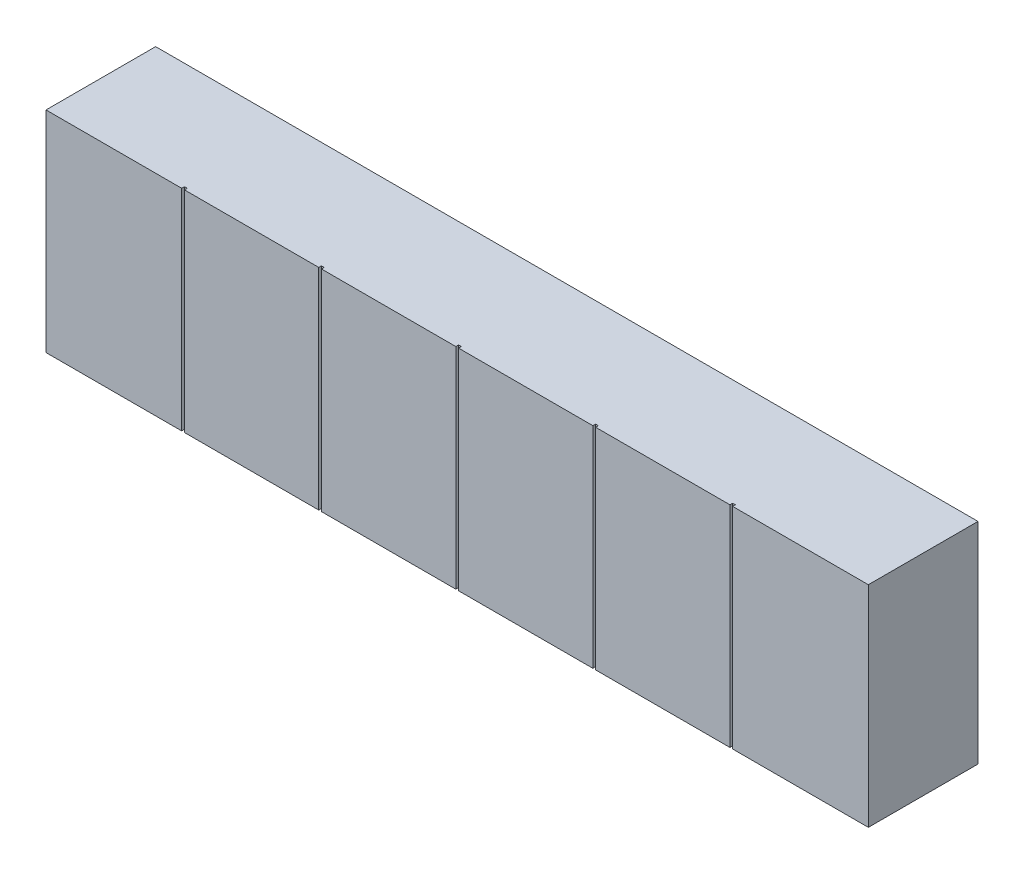
ISO-10303-21;
HEADER;
FILE_DESCRIPTION(('STEP AP214'),'2;1');
FILE_NAME('part.step','',(''),(''),'','','');
FILE_SCHEMA(('AUTOMOTIVE_DESIGN { 1 0 10303 214 1 1 1 1 }'));
ENDSEC;
DATA;
#1=APPLICATION_CONTEXT('core data for automotive mechanical design processes');
#2=APPLICATION_PROTOCOL_DEFINITION('international standard','automotive_design',2000,#1);
#3=PRODUCT_CONTEXT('',#1,'mechanical');
#4=PRODUCT('Part','Part','',(#3));
#5=PRODUCT_RELATED_PRODUCT_CATEGORY('part','',(#4));
#6=PRODUCT_DEFINITION_FORMATION('','',#4);
#7=PRODUCT_DEFINITION_CONTEXT('part definition',#1,'design');
#8=PRODUCT_DEFINITION('design','',#6,#7);
#9=PRODUCT_DEFINITION_SHAPE('','',#8);
#10=(LENGTH_UNIT() NAMED_UNIT(*) SI_UNIT(.MILLI.,.METRE.));
#11=(NAMED_UNIT(*) PLANE_ANGLE_UNIT() SI_UNIT($,.RADIAN.));
#12=(NAMED_UNIT(*) SI_UNIT($,.STERADIAN.) SOLID_ANGLE_UNIT());
#13=UNCERTAINTY_MEASURE_WITH_UNIT(LENGTH_MEASURE(1.E-05),#10,'distance_accuracy_value','');
#14=(GEOMETRIC_REPRESENTATION_CONTEXT(3) GLOBAL_UNCERTAINTY_ASSIGNED_CONTEXT((#13)) GLOBAL_UNIT_ASSIGNED_CONTEXT((#10,
#11,#12)) REPRESENTATION_CONTEXT('',''));
#15=CARTESIAN_POINT('',(0.,0.,0.));
#16=DIRECTION('',(0.,0.,1.));
#17=DIRECTION('',(1.,0.,0.));
#18=AXIS2_PLACEMENT_3D('',#15,#16,#17);
#19=CARTESIAN_POINT('',(0.,0.,120.));
#20=DIRECTION('',(0.,0.,-1.));
#21=DIRECTION('',(-1.,0.,0.));
#22=AXIS2_PLACEMENT_3D('',#19,#20,#21);
#23=PLANE('',#22);
#24=DIRECTION('',(1.,0.,0.));
#25=VECTOR('',#24,1.);
#26=CARTESIAN_POINT('',(-450.,-115.,120.));
#27=LINE('',#26,#25);
#28=CARTESIAN_POINT('',(-298.5,-115.,120.));
#29=VERTEX_POINT('',#28);
#30=CARTESIAN_POINT('',(-151.5,-115.,120.));
#31=VERTEX_POINT('',#30);
#32=EDGE_CURVE('E353',#29,#31,#27,.T.);
#33=ORIENTED_EDGE('',*,*,#32,.T.);
#34=DIRECTION('',(0.,-1.,0.));
#35=VECTOR('',#34,1.);
#36=CARTESIAN_POINT('',(-151.5,115.,120.));
#37=LINE('',#36,#35);
#38=CARTESIAN_POINT('',(-151.5,115.,120.));
#39=VERTEX_POINT('',#38);
#40=EDGE_CURVE('E199',#39,#31,#37,.T.);
#41=ORIENTED_EDGE('',*,*,#40,.F.);
#42=DIRECTION('',(-1.,0.,0.));
#43=VECTOR('',#42,1.);
#44=CARTESIAN_POINT('',(-450.,115.,120.));
#45=LINE('',#44,#43);
#46=CARTESIAN_POINT('',(-298.5,115.,120.));
#47=VERTEX_POINT('',#46);
#48=EDGE_CURVE('E346',#39,#47,#45,.T.);
#49=ORIENTED_EDGE('',*,*,#48,.T.);
#50=DIRECTION('',(0.,1.,0.));
#51=VECTOR('',#50,1.);
#52=CARTESIAN_POINT('',(-298.5,115.,120.));
#53=LINE('',#52,#51);
#54=EDGE_CURVE('E313',#29,#47,#53,.T.);
#55=ORIENTED_EDGE('',*,*,#54,.F.);
#56=EDGE_LOOP('',(#33,#41,#49,#55));
#57=FACE_BOUND('',#56,.T.);
#58=ADVANCED_FACE('F33',(#57),#23,.F.);
#59=CARTESIAN_POINT('',(-1.50000000000011,115.,120.));
#60=VERTEX_POINT('',#59);
#61=CARTESIAN_POINT('',(-148.5,115.,120.));
#62=VERTEX_POINT('',#61);
#63=EDGE_CURVE('E418',#60,#62,#45,.T.);
#64=ORIENTED_EDGE('',*,*,#63,.T.);
#65=DIRECTION('',(0.,1.,0.));
#66=VECTOR('',#65,1.);
#67=CARTESIAN_POINT('',(-148.5,115.,120.));
#68=LINE('',#67,#66);
#69=CARTESIAN_POINT('',(-148.5,-115.,120.));
#70=VERTEX_POINT('',#69);
#71=EDGE_CURVE('E215',#70,#62,#68,.T.);
#72=ORIENTED_EDGE('',*,*,#71,.F.);
#73=CARTESIAN_POINT('',(-1.5,-115.,120.));
#74=VERTEX_POINT('',#73);
#75=EDGE_CURVE('E393',#70,#74,#27,.T.);
#76=ORIENTED_EDGE('',*,*,#75,.T.);
#77=DIRECTION('',(0.,-1.,0.));
#78=VECTOR('',#77,1.);
#79=CARTESIAN_POINT('',(-1.50000000000011,115.,120.));
#80=LINE('',#79,#78);
#81=EDGE_CURVE('E248',#60,#74,#80,.T.);
#82=ORIENTED_EDGE('',*,*,#81,.F.);
#83=EDGE_LOOP('',(#64,#72,#76,#82));
#84=FACE_BOUND('',#83,.T.);
#85=ADVANCED_FACE('F426',(#84),#23,.F.);
#86=CARTESIAN_POINT('',(148.5,115.,120.));
#87=VERTEX_POINT('',#86);
#88=CARTESIAN_POINT('',(1.5,115.,120.));
#89=VERTEX_POINT('',#88);
#90=EDGE_CURVE('E420',#87,#89,#45,.T.);
#91=ORIENTED_EDGE('',*,*,#90,.T.);
#92=DIRECTION('',(0.,1.,0.));
#93=VECTOR('',#92,1.);
#94=CARTESIAN_POINT('',(1.5,115.,120.));
#95=LINE('',#94,#93);
#96=CARTESIAN_POINT('',(1.49999999999995,-115.,120.));
#97=VERTEX_POINT('',#96);
#98=EDGE_CURVE('E238',#97,#89,#95,.T.);
#99=ORIENTED_EDGE('',*,*,#98,.F.);
#100=CARTESIAN_POINT('',(148.5,-115.,120.));
#101=VERTEX_POINT('',#100);
#102=EDGE_CURVE('E388',#97,#101,#27,.T.);
#103=ORIENTED_EDGE('',*,*,#102,.T.);
#104=DIRECTION('',(0.,-1.,0.));
#105=VECTOR('',#104,1.);
#106=CARTESIAN_POINT('',(148.5,115.,120.));
#107=LINE('',#106,#105);
#108=EDGE_CURVE('E274',#87,#101,#107,.T.);
#109=ORIENTED_EDGE('',*,*,#108,.F.);
#110=EDGE_LOOP('',(#91,#99,#103,#109));
#111=FACE_BOUND('',#110,.T.);
#112=ADVANCED_FACE('F446',(#111),#23,.F.);
#113=CARTESIAN_POINT('',(298.5,115.,120.));
#114=VERTEX_POINT('',#113);
#115=CARTESIAN_POINT('',(151.5,115.,120.));
#116=VERTEX_POINT('',#115);
#117=EDGE_CURVE('E345',#114,#116,#45,.T.);
#118=ORIENTED_EDGE('',*,*,#117,.T.);
#119=DIRECTION('',(0.,1.,0.));
#120=VECTOR('',#119,1.);
#121=CARTESIAN_POINT('',(151.5,115.,120.));
#122=LINE('',#121,#120);
#123=CARTESIAN_POINT('',(151.5,-115.,120.));
#124=VERTEX_POINT('',#123);
#125=EDGE_CURVE('E264',#124,#116,#122,.T.);
#126=ORIENTED_EDGE('',*,*,#125,.F.);
#127=CARTESIAN_POINT('',(298.5,-115.,120.));
#128=VERTEX_POINT('',#127);
#129=EDGE_CURVE('E386',#124,#128,#27,.T.);
#130=ORIENTED_EDGE('',*,*,#129,.T.);
#131=DIRECTION('',(0.,-1.,0.));
#132=VECTOR('',#131,1.);
#133=CARTESIAN_POINT('',(298.5,115.,120.));
#134=LINE('',#133,#132);
#135=EDGE_CURVE('E299',#114,#128,#134,.T.);
#136=ORIENTED_EDGE('',*,*,#135,.F.);
#137=EDGE_LOOP('',(#118,#126,#130,#136));
#138=FACE_BOUND('',#137,.T.);
#139=ADVANCED_FACE('F456',(#138),#23,.F.);
#140=CARTESIAN_POINT('',(-450.,-115.,120.));
#141=VERTEX_POINT('',#140);
#142=CARTESIAN_POINT('',(-301.5,-115.,120.));
#143=VERTEX_POINT('',#142);
#144=EDGE_CURVE('E349',#141,#143,#27,.T.);
#145=ORIENTED_EDGE('',*,*,#144,.T.);
#146=DIRECTION('',(0.,-1.,0.));
#147=VECTOR('',#146,1.);
#148=CARTESIAN_POINT('',(-301.5,115.,120.));
#149=LINE('',#148,#147);
#150=CARTESIAN_POINT('',(-301.5,115.,120.));
#151=VERTEX_POINT('',#150);
#152=EDGE_CURVE('E229',#151,#143,#149,.T.);
#153=ORIENTED_EDGE('',*,*,#152,.F.);
#154=CARTESIAN_POINT('',(-450.,115.,120.));
#155=VERTEX_POINT('',#154);
#156=EDGE_CURVE('E339',#151,#155,#45,.T.);
#157=ORIENTED_EDGE('',*,*,#156,.T.);
#158=DIRECTION('',(0.,-1.,0.));
#159=VECTOR('',#158,1.);
#160=CARTESIAN_POINT('',(-450.,-115.,120.));
#161=LINE('',#160,#159);
#162=EDGE_CURVE('E344',#155,#141,#161,.T.);
#163=ORIENTED_EDGE('',*,*,#162,.T.);
#164=EDGE_LOOP('',(#145,#153,#157,#163));
#165=FACE_BOUND('',#164,.T.);
#166=ADVANCED_FACE('F417',(#165),#23,.F.);
#167=CARTESIAN_POINT('',(450.,-115.,120.));
#168=DIRECTION('',(-1.,0.,0.));
#169=DIRECTION('',(0.,0.,1.));
#170=AXIS2_PLACEMENT_3D('',#167,#168,#169);
#171=PLANE('',#170);
#172=DIRECTION('',(0.,1.,0.));
#173=VECTOR('',#172,1.);
#174=CARTESIAN_POINT('',(450.,-115.,0.));
#175=LINE('',#174,#173);
#176=CARTESIAN_POINT('',(450.,-115.,0.));
#177=VERTEX_POINT('',#176);
#178=CARTESIAN_POINT('',(450.,115.,0.));
#179=VERTEX_POINT('',#178);
#180=EDGE_CURVE('E328',#177,#179,#175,.T.);
#181=ORIENTED_EDGE('',*,*,#180,.T.);
#182=DIRECTION('',(0.,0.,-1.));
#183=VECTOR('',#182,1.);
#184=CARTESIAN_POINT('',(450.,115.,120.));
#185=LINE('',#184,#183);
#186=CARTESIAN_POINT('',(450.,115.,120.));
#187=VERTEX_POINT('',#186);
#188=EDGE_CURVE('E11',#187,#179,#185,.T.);
#189=ORIENTED_EDGE('',*,*,#188,.F.);
#190=DIRECTION('',(0.,1.,0.));
#191=VECTOR('',#190,1.);
#192=CARTESIAN_POINT('',(450.,-115.,120.));
#193=LINE('',#192,#191);
#194=CARTESIAN_POINT('',(450.,-115.,120.));
#195=VERTEX_POINT('',#194);
#196=EDGE_CURVE('E336',#195,#187,#193,.T.);
#197=ORIENTED_EDGE('',*,*,#196,.F.);
#198=DIRECTION('',(0.,0.,-1.));
#199=VECTOR('',#198,1.);
#200=CARTESIAN_POINT('',(450.,-115.,120.));
#201=LINE('',#200,#199);
#202=EDGE_CURVE('E352',#195,#177,#201,.T.);
#203=ORIENTED_EDGE('',*,*,#202,.T.);
#204=EDGE_LOOP('',(#181,#189,#197,#203));
#205=FACE_BOUND('',#204,.T.);
#206=ADVANCED_FACE('F35',(#205),#171,.F.);
#207=CARTESIAN_POINT('',(-450.,115.,120.));
#208=DIRECTION('',(0.,-1.,0.));
#209=DIRECTION('',(0.,0.,-1.));
#210=AXIS2_PLACEMENT_3D('',#207,#208,#209);
#211=PLANE('',#210);
#212=ORIENTED_EDGE('',*,*,#48,.F.);
#213=DIRECTION('',(0.,0.,1.));
#214=VECTOR('',#213,1.);
#215=CARTESIAN_POINT('',(-151.5,115.,117.));
#216=LINE('',#215,#214);
#217=CARTESIAN_POINT('',(-151.5,115.,117.));
#218=VERTEX_POINT('',#217);
#219=EDGE_CURVE('E227',#218,#39,#216,.T.);
#220=ORIENTED_EDGE('',*,*,#219,.F.);
#221=DIRECTION('',(-1.,0.,0.));
#222=VECTOR('',#221,1.);
#223=CARTESIAN_POINT('',(-151.5,115.,117.));
#224=LINE('',#223,#222);
#225=CARTESIAN_POINT('',(-148.5,115.,117.));
#226=VERTEX_POINT('',#225);
#227=EDGE_CURVE('E205',#226,#218,#224,.T.);
#228=ORIENTED_EDGE('',*,*,#227,.F.);
#229=DIRECTION('',(0.,0.,1.));
#230=VECTOR('',#229,1.);
#231=CARTESIAN_POINT('',(-148.5,115.,117.));
#232=LINE('',#231,#230);
#233=EDGE_CURVE('E230',#226,#62,#232,.T.);
#234=ORIENTED_EDGE('',*,*,#233,.T.);
#235=ORIENTED_EDGE('',*,*,#63,.F.);
#236=DIRECTION('',(0.,0.,1.));
#237=VECTOR('',#236,1.);
#238=CARTESIAN_POINT('',(-1.50000000000011,115.,117.));
#239=LINE('',#238,#237);
#240=CARTESIAN_POINT('',(-1.50000000000011,115.,117.));
#241=VERTEX_POINT('',#240);
#242=EDGE_CURVE('E225',#241,#60,#239,.T.);
#243=ORIENTED_EDGE('',*,*,#242,.F.);
#244=DIRECTION('',(-1.,0.,0.));
#245=VECTOR('',#244,1.);
#246=CARTESIAN_POINT('',(-1.50000000000011,115.,117.));
#247=LINE('',#246,#245);
#248=CARTESIAN_POINT('',(1.5,115.,117.));
#249=VERTEX_POINT('',#248);
#250=EDGE_CURVE('E244',#249,#241,#247,.T.);
#251=ORIENTED_EDGE('',*,*,#250,.F.);
#252=DIRECTION('',(0.,0.,1.));
#253=VECTOR('',#252,1.);
#254=CARTESIAN_POINT('',(1.5,115.,117.));
#255=LINE('',#254,#253);
#256=EDGE_CURVE('E253',#249,#89,#255,.T.);
#257=ORIENTED_EDGE('',*,*,#256,.T.);
#258=ORIENTED_EDGE('',*,*,#90,.F.);
#259=DIRECTION('',(0.,0.,1.));
#260=VECTOR('',#259,1.);
#261=CARTESIAN_POINT('',(148.5,115.,117.));
#262=LINE('',#261,#260);
#263=CARTESIAN_POINT('',(148.5,115.,117.));
#264=VERTEX_POINT('',#263);
#265=EDGE_CURVE('E250',#264,#87,#262,.T.);
#266=ORIENTED_EDGE('',*,*,#265,.F.);
#267=DIRECTION('',(-1.,0.,0.));
#268=VECTOR('',#267,1.);
#269=CARTESIAN_POINT('',(148.5,115.,117.));
#270=LINE('',#269,#268);
#271=CARTESIAN_POINT('',(151.5,115.,117.));
#272=VERTEX_POINT('',#271);
#273=EDGE_CURVE('E270',#272,#264,#270,.T.);
#274=ORIENTED_EDGE('',*,*,#273,.F.);
#275=DIRECTION('',(0.,0.,1.));
#276=VECTOR('',#275,1.);
#277=CARTESIAN_POINT('',(151.5,115.,117.));
#278=LINE('',#277,#276);
#279=EDGE_CURVE('E279',#272,#116,#278,.T.);
#280=ORIENTED_EDGE('',*,*,#279,.T.);
#281=ORIENTED_EDGE('',*,*,#117,.F.);
#282=DIRECTION('',(0.,0.,1.));
#283=VECTOR('',#282,1.);
#284=CARTESIAN_POINT('',(298.5,115.,117.));
#285=LINE('',#284,#283);
#286=CARTESIAN_POINT('',(298.5,115.,117.));
#287=VERTEX_POINT('',#286);
#288=EDGE_CURVE('E276',#287,#114,#285,.T.);
#289=ORIENTED_EDGE('',*,*,#288,.F.);
#290=DIRECTION('',(-1.,0.,0.));
#291=VECTOR('',#290,1.);
#292=CARTESIAN_POINT('',(298.5,115.,117.));
#293=LINE('',#292,#291);
#294=CARTESIAN_POINT('',(301.5,115.,117.));
#295=VERTEX_POINT('',#294);
#296=EDGE_CURVE('E295',#295,#287,#293,.T.);
#297=ORIENTED_EDGE('',*,*,#296,.F.);
#298=DIRECTION('',(0.,0.,1.));
#299=VECTOR('',#298,1.);
#300=CARTESIAN_POINT('',(301.5,115.,117.));
#301=LINE('',#300,#299);
#302=CARTESIAN_POINT('',(301.5,115.,120.));
#303=VERTEX_POINT('',#302);
#304=EDGE_CURVE('E303',#295,#303,#301,.T.);
#305=ORIENTED_EDGE('',*,*,#304,.T.);
#306=EDGE_CURVE('E341',#187,#303,#45,.T.);
#307=ORIENTED_EDGE('',*,*,#306,.F.);
#308=ORIENTED_EDGE('',*,*,#188,.T.);
#309=DIRECTION('',(-1.,0.,0.));
#310=VECTOR('',#309,1.);
#311=CARTESIAN_POINT('',(-450.,115.,0.));
#312=LINE('',#311,#310);
#313=CARTESIAN_POINT('',(-450.,115.,0.));
#314=VERTEX_POINT('',#313);
#315=EDGE_CURVE('E356',#179,#314,#312,.T.);
#316=ORIENTED_EDGE('',*,*,#315,.T.);
#317=DIRECTION('',(0.,0.,-1.));
#318=VECTOR('',#317,1.);
#319=CARTESIAN_POINT('',(-450.,115.,120.));
#320=LINE('',#319,#318);
#321=EDGE_CURVE('E41',#155,#314,#320,.T.);
#322=ORIENTED_EDGE('',*,*,#321,.F.);
#323=ORIENTED_EDGE('',*,*,#156,.F.);
#324=DIRECTION('',(0.,0.,1.));
#325=VECTOR('',#324,1.);
#326=CARTESIAN_POINT('',(-301.5,115.,117.));
#327=LINE('',#326,#325);
#328=CARTESIAN_POINT('',(-301.5,115.,117.));
#329=VERTEX_POINT('',#328);
#330=EDGE_CURVE('E326',#329,#151,#327,.T.);
#331=ORIENTED_EDGE('',*,*,#330,.F.);
#332=DIRECTION('',(-1.,0.,0.));
#333=VECTOR('',#332,1.);
#334=CARTESIAN_POINT('',(-301.5,115.,117.));
#335=LINE('',#334,#333);
#336=CARTESIAN_POINT('',(-298.5,115.,117.));
#337=VERTEX_POINT('',#336);
#338=EDGE_CURVE('E319',#337,#329,#335,.T.);
#339=ORIENTED_EDGE('',*,*,#338,.F.);
#340=DIRECTION('',(0.,0.,1.));
#341=VECTOR('',#340,1.);
#342=CARTESIAN_POINT('',(-298.5,115.,117.));
#343=LINE('',#342,#341);
#344=EDGE_CURVE('E329',#337,#47,#343,.T.);
#345=ORIENTED_EDGE('',*,*,#344,.T.);
#346=EDGE_LOOP('',(#212,#220,#228,#234,#235,#243,#251,#257,#258,#266,#274,#280,#281,#289,#297,
#305,#307,#308,#316,#322,#323,#331,#339,#345));
#347=FACE_BOUND('',#346,.T.);
#348=ADVANCED_FACE('F428',(#347),#211,.F.);
#349=CARTESIAN_POINT('',(-450.,-115.,120.));
#350=DIRECTION('',(1.,0.,0.));
#351=DIRECTION('',(0.,0.,-1.));
#352=AXIS2_PLACEMENT_3D('',#349,#350,#351);
#353=PLANE('',#352);
#354=DIRECTION('',(0.,-1.,0.));
#355=VECTOR('',#354,1.);
#356=CARTESIAN_POINT('',(-450.,-115.,0.));
#357=LINE('',#356,#355);
#358=CARTESIAN_POINT('',(-450.,-115.,0.));
#359=VERTEX_POINT('',#358);
#360=EDGE_CURVE('E358',#314,#359,#357,.T.);
#361=ORIENTED_EDGE('',*,*,#360,.T.);
#362=DIRECTION('',(0.,0.,-1.));
#363=VECTOR('',#362,1.);
#364=CARTESIAN_POINT('',(-450.,-115.,120.));
#365=LINE('',#364,#363);
#366=EDGE_CURVE('E363',#141,#359,#365,.T.);
#367=ORIENTED_EDGE('',*,*,#366,.F.);
#368=ORIENTED_EDGE('',*,*,#162,.F.);
#369=ORIENTED_EDGE('',*,*,#321,.T.);
#370=EDGE_LOOP('',(#361,#367,#368,#369));
#371=FACE_BOUND('',#370,.T.);
#372=ADVANCED_FACE('F370',(#371),#353,.F.);
#373=CARTESIAN_POINT('',(-450.,-115.,120.));
#374=DIRECTION('',(0.,1.,0.));
#375=DIRECTION('',(0.,0.,1.));
#376=AXIS2_PLACEMENT_3D('',#373,#374,#375);
#377=PLANE('',#376);
#378=DIRECTION('',(1.,0.,0.));
#379=VECTOR('',#378,1.);
#380=CARTESIAN_POINT('',(-151.5,-115.,117.));
#381=LINE('',#380,#379);
#382=CARTESIAN_POINT('',(-151.5,-115.,117.));
#383=VERTEX_POINT('',#382);
#384=CARTESIAN_POINT('',(-148.5,-115.,117.));
#385=VERTEX_POINT('',#384);
#386=EDGE_CURVE('E211',#383,#385,#381,.T.);
#387=ORIENTED_EDGE('',*,*,#386,.F.);
#388=DIRECTION('',(0.,0.,1.));
#389=VECTOR('',#388,1.);
#390=CARTESIAN_POINT('',(-151.5,-115.,117.));
#391=LINE('',#390,#389);
#392=EDGE_CURVE('E193',#383,#31,#391,.T.);
#393=ORIENTED_EDGE('',*,*,#392,.T.);
#394=ORIENTED_EDGE('',*,*,#32,.F.);
#395=DIRECTION('',(0.,0.,1.));
#396=VECTOR('',#395,1.);
#397=CARTESIAN_POINT('',(-298.5,-115.,117.));
#398=LINE('',#397,#396);
#399=CARTESIAN_POINT('',(-298.5,-115.,117.));
#400=VERTEX_POINT('',#399);
#401=EDGE_CURVE('E332',#400,#29,#398,.T.);
#402=ORIENTED_EDGE('',*,*,#401,.F.);
#403=DIRECTION('',(1.,0.,0.));
#404=VECTOR('',#403,1.);
#405=CARTESIAN_POINT('',(-301.5,-115.,117.));
#406=LINE('',#405,#404);
#407=CARTESIAN_POINT('',(-301.5,-115.,117.));
#408=VERTEX_POINT('',#407);
#409=EDGE_CURVE('E312',#408,#400,#406,.T.);
#410=ORIENTED_EDGE('',*,*,#409,.F.);
#411=DIRECTION('',(0.,0.,1.));
#412=VECTOR('',#411,1.);
#413=CARTESIAN_POINT('',(-301.5,-115.,117.));
#414=LINE('',#413,#412);
#415=EDGE_CURVE('E322',#408,#143,#414,.T.);
#416=ORIENTED_EDGE('',*,*,#415,.T.);
#417=ORIENTED_EDGE('',*,*,#144,.F.);
#418=ORIENTED_EDGE('',*,*,#366,.T.);
#419=DIRECTION('',(1.,0.,0.));
#420=VECTOR('',#419,1.);
#421=CARTESIAN_POINT('',(-450.,-115.,0.));
#422=LINE('',#421,#420);
#423=EDGE_CURVE('E340',#359,#177,#422,.T.);
#424=ORIENTED_EDGE('',*,*,#423,.T.);
#425=ORIENTED_EDGE('',*,*,#202,.F.);
#426=CARTESIAN_POINT('',(301.5,-115.,120.));
#427=VERTEX_POINT('',#426);
#428=EDGE_CURVE('E348',#427,#195,#27,.T.);
#429=ORIENTED_EDGE('',*,*,#428,.F.);
#430=DIRECTION('',(0.,0.,1.));
#431=VECTOR('',#430,1.);
#432=CARTESIAN_POINT('',(301.5,-115.,117.));
#433=LINE('',#432,#431);
#434=CARTESIAN_POINT('',(301.5,-115.,117.));
#435=VERTEX_POINT('',#434);
#436=EDGE_CURVE('E48',#435,#427,#433,.T.);
#437=ORIENTED_EDGE('',*,*,#436,.F.);
#438=DIRECTION('',(1.,0.,0.));
#439=VECTOR('',#438,1.);
#440=CARTESIAN_POINT('',(298.5,-115.,117.));
#441=LINE('',#440,#439);
#442=CARTESIAN_POINT('',(298.5,-115.,117.));
#443=VERTEX_POINT('',#442);
#444=EDGE_CURVE('E288',#443,#435,#441,.T.);
#445=ORIENTED_EDGE('',*,*,#444,.F.);
#446=DIRECTION('',(0.,0.,1.));
#447=VECTOR('',#446,1.);
#448=CARTESIAN_POINT('',(298.5,-115.,117.));
#449=LINE('',#448,#447);
#450=EDGE_CURVE('E298',#443,#128,#449,.T.);
#451=ORIENTED_EDGE('',*,*,#450,.T.);
#452=ORIENTED_EDGE('',*,*,#129,.F.);
#453=DIRECTION('',(0.,0.,1.));
#454=VECTOR('',#453,1.);
#455=CARTESIAN_POINT('',(151.5,-115.,117.));
#456=LINE('',#455,#454);
#457=CARTESIAN_POINT('',(151.5,-115.,117.));
#458=VERTEX_POINT('',#457);
#459=EDGE_CURVE('E56',#458,#124,#456,.T.);
#460=ORIENTED_EDGE('',*,*,#459,.F.);
#461=DIRECTION('',(1.,0.,0.));
#462=VECTOR('',#461,1.);
#463=CARTESIAN_POINT('',(148.5,-115.,117.));
#464=LINE('',#463,#462);
#465=CARTESIAN_POINT('',(148.5,-115.,117.));
#466=VERTEX_POINT('',#465);
#467=EDGE_CURVE('E263',#466,#458,#464,.T.);
#468=ORIENTED_EDGE('',*,*,#467,.F.);
#469=DIRECTION('',(0.,0.,1.));
#470=VECTOR('',#469,1.);
#471=CARTESIAN_POINT('',(148.5,-115.,117.));
#472=LINE('',#471,#470);
#473=EDGE_CURVE('E273',#466,#101,#472,.T.);
#474=ORIENTED_EDGE('',*,*,#473,.T.);
#475=ORIENTED_EDGE('',*,*,#102,.F.);
#476=DIRECTION('',(0.,0.,1.));
#477=VECTOR('',#476,1.);
#478=CARTESIAN_POINT('',(1.49999999999995,-115.,117.));
#479=LINE('',#478,#477);
#480=CARTESIAN_POINT('',(1.49999999999995,-115.,117.));
#481=VERTEX_POINT('',#480);
#482=EDGE_CURVE('E256',#481,#97,#479,.T.);
#483=ORIENTED_EDGE('',*,*,#482,.F.);
#484=DIRECTION('',(1.,0.,0.));
#485=VECTOR('',#484,1.);
#486=CARTESIAN_POINT('',(-1.5,-115.,117.));
#487=LINE('',#486,#485);
#488=CARTESIAN_POINT('',(-1.5,-115.,117.));
#489=VERTEX_POINT('',#488);
#490=EDGE_CURVE('E237',#489,#481,#487,.T.);
#491=ORIENTED_EDGE('',*,*,#490,.F.);
#492=DIRECTION('',(0.,0.,1.));
#493=VECTOR('',#492,1.);
#494=CARTESIAN_POINT('',(-1.5,-115.,117.));
#495=LINE('',#494,#493);
#496=EDGE_CURVE('E247',#489,#74,#495,.T.);
#497=ORIENTED_EDGE('',*,*,#496,.T.);
#498=ORIENTED_EDGE('',*,*,#75,.F.);
#499=DIRECTION('',(0.,0.,1.));
#500=VECTOR('',#499,1.);
#501=CARTESIAN_POINT('',(-148.5,-115.,117.));
#502=LINE('',#501,#500);
#503=EDGE_CURVE('E204',#385,#70,#502,.T.);
#504=ORIENTED_EDGE('',*,*,#503,.F.);
#505=EDGE_LOOP('',(#387,#393,#394,#402,#410,#416,#417,#418,#424,#425,#429,#437,#445,#451,#452,
#460,#468,#474,#475,#483,#491,#497,#498,#504));
#506=FACE_BOUND('',#505,.T.);
#507=ADVANCED_FACE('F217',(#506),#377,.F.);
#508=ORIENTED_EDGE('',*,*,#306,.T.);
#509=DIRECTION('',(0.,1.,0.));
#510=VECTOR('',#509,1.);
#511=CARTESIAN_POINT('',(301.5,115.,120.));
#512=LINE('',#511,#510);
#513=EDGE_CURVE('E289',#427,#303,#512,.T.);
#514=ORIENTED_EDGE('',*,*,#513,.F.);
#515=ORIENTED_EDGE('',*,*,#428,.T.);
#516=ORIENTED_EDGE('',*,*,#196,.T.);
#517=EDGE_LOOP('',(#508,#514,#515,#516));
#518=FACE_BOUND('',#517,.T.);
#519=ADVANCED_FACE('F385',(#518),#23,.F.);
#520=CARTESIAN_POINT('',(0.,0.,0.));
#521=DIRECTION('',(0.,0.,-1.));
#522=DIRECTION('',(-1.,0.,0.));
#523=AXIS2_PLACEMENT_3D('',#520,#521,#522);
#524=PLANE('',#523);
#525=ORIENTED_EDGE('',*,*,#180,.F.);
#526=ORIENTED_EDGE('',*,*,#423,.F.);
#527=ORIENTED_EDGE('',*,*,#360,.F.);
#528=ORIENTED_EDGE('',*,*,#315,.F.);
#529=EDGE_LOOP('',(#525,#526,#527,#528));
#530=FACE_BOUND('',#529,.T.);
#531=ADVANCED_FACE('F377',(#530),#524,.T.);
#532=CARTESIAN_POINT('',(-301.5,115.,117.));
#533=DIRECTION('',(-1.,0.,0.));
#534=DIRECTION('',(0.,-1.,0.));
#535=AXIS2_PLACEMENT_3D('',#532,#533,#534);
#536=PLANE('',#535);
#537=ORIENTED_EDGE('',*,*,#152,.T.);
#538=ORIENTED_EDGE('',*,*,#415,.F.);
#539=DIRECTION('',(0.,-1.,0.));
#540=VECTOR('',#539,1.);
#541=CARTESIAN_POINT('',(-301.5,115.,117.));
#542=LINE('',#541,#540);
#543=EDGE_CURVE('E309',#329,#408,#542,.T.);
#544=ORIENTED_EDGE('',*,*,#543,.F.);
#545=ORIENTED_EDGE('',*,*,#330,.T.);
#546=EDGE_LOOP('',(#537,#538,#544,#545));
#547=FACE_BOUND('',#546,.T.);
#548=ADVANCED_FACE('F414',(#547),#536,.F.);
#549=CARTESIAN_POINT('',(-298.5,115.,117.));
#550=DIRECTION('',(1.,0.,0.));
#551=DIRECTION('',(0.,1.,0.));
#552=AXIS2_PLACEMENT_3D('',#549,#550,#551);
#553=PLANE('',#552);
#554=ORIENTED_EDGE('',*,*,#54,.T.);
#555=ORIENTED_EDGE('',*,*,#344,.F.);
#556=DIRECTION('',(0.,1.,0.));
#557=VECTOR('',#556,1.);
#558=CARTESIAN_POINT('',(-298.5,115.,117.));
#559=LINE('',#558,#557);
#560=EDGE_CURVE('E316',#400,#337,#559,.T.);
#561=ORIENTED_EDGE('',*,*,#560,.F.);
#562=ORIENTED_EDGE('',*,*,#401,.T.);
#563=EDGE_LOOP('',(#554,#555,#561,#562));
#564=FACE_BOUND('',#563,.T.);
#565=ADVANCED_FACE('F408',(#564),#553,.F.);
#566=CARTESIAN_POINT('',(0.,0.,117.));
#567=DIRECTION('',(0.,0.,1.));
#568=DIRECTION('',(1.,0.,0.));
#569=AXIS2_PLACEMENT_3D('',#566,#567,#568);
#570=PLANE('',#569);
#571=ORIENTED_EDGE('',*,*,#543,.T.);
#572=ORIENTED_EDGE('',*,*,#409,.T.);
#573=ORIENTED_EDGE('',*,*,#560,.T.);
#574=ORIENTED_EDGE('',*,*,#338,.T.);
#575=EDGE_LOOP('',(#571,#572,#573,#574));
#576=FACE_BOUND('',#575,.T.);
#577=ADVANCED_FACE('F411',(#576),#570,.T.);
#578=CARTESIAN_POINT('',(298.5,115.,117.));
#579=DIRECTION('',(-1.,0.,0.));
#580=DIRECTION('',(0.,-1.,0.));
#581=AXIS2_PLACEMENT_3D('',#578,#579,#580);
#582=PLANE('',#581);
#583=ORIENTED_EDGE('',*,*,#135,.T.);
#584=ORIENTED_EDGE('',*,*,#450,.F.);
#585=DIRECTION('',(0.,-1.,0.));
#586=VECTOR('',#585,1.);
#587=CARTESIAN_POINT('',(298.5,115.,117.));
#588=LINE('',#587,#586);
#589=EDGE_CURVE('E285',#287,#443,#588,.T.);
#590=ORIENTED_EDGE('',*,*,#589,.F.);
#591=ORIENTED_EDGE('',*,*,#288,.T.);
#592=EDGE_LOOP('',(#583,#584,#590,#591));
#593=FACE_BOUND('',#592,.T.);
#594=ADVANCED_FACE('F537',(#593),#582,.F.);
#595=CARTESIAN_POINT('',(301.5,115.,117.));
#596=DIRECTION('',(1.,0.,0.));
#597=DIRECTION('',(0.,1.,0.));
#598=AXIS2_PLACEMENT_3D('',#595,#596,#597);
#599=PLANE('',#598);
#600=ORIENTED_EDGE('',*,*,#513,.T.);
#601=ORIENTED_EDGE('',*,*,#304,.F.);
#602=DIRECTION('',(0.,1.,0.));
#603=VECTOR('',#602,1.);
#604=CARTESIAN_POINT('',(301.5,115.,117.));
#605=LINE('',#604,#603);
#606=EDGE_CURVE('E292',#435,#295,#605,.T.);
#607=ORIENTED_EDGE('',*,*,#606,.F.);
#608=ORIENTED_EDGE('',*,*,#436,.T.);
#609=EDGE_LOOP('',(#600,#601,#607,#608));
#610=FACE_BOUND('',#609,.T.);
#611=ADVANCED_FACE('F546',(#610),#599,.F.);
#612=CARTESIAN_POINT('',(0.,0.,117.));
#613=DIRECTION('',(0.,0.,1.));
#614=DIRECTION('',(1.,0.,0.));
#615=AXIS2_PLACEMENT_3D('',#612,#613,#614);
#616=PLANE('',#615);
#617=ORIENTED_EDGE('',*,*,#589,.T.);
#618=ORIENTED_EDGE('',*,*,#444,.T.);
#619=ORIENTED_EDGE('',*,*,#606,.T.);
#620=ORIENTED_EDGE('',*,*,#296,.T.);
#621=EDGE_LOOP('',(#617,#618,#619,#620));
#622=FACE_BOUND('',#621,.T.);
#623=ADVANCED_FACE('F556',(#622),#616,.T.);
#624=CARTESIAN_POINT('',(148.5,115.,117.));
#625=DIRECTION('',(-1.,0.,0.));
#626=DIRECTION('',(0.,-1.,0.));
#627=AXIS2_PLACEMENT_3D('',#624,#625,#626);
#628=PLANE('',#627);
#629=ORIENTED_EDGE('',*,*,#108,.T.);
#630=ORIENTED_EDGE('',*,*,#473,.F.);
#631=DIRECTION('',(0.,-1.,0.));
#632=VECTOR('',#631,1.);
#633=CARTESIAN_POINT('',(148.5,115.,117.));
#634=LINE('',#633,#632);
#635=EDGE_CURVE('E260',#264,#466,#634,.T.);
#636=ORIENTED_EDGE('',*,*,#635,.F.);
#637=ORIENTED_EDGE('',*,*,#265,.T.);
#638=EDGE_LOOP('',(#629,#630,#636,#637));
#639=FACE_BOUND('',#638,.T.);
#640=ADVANCED_FACE('F565',(#639),#628,.F.);
#641=CARTESIAN_POINT('',(151.5,115.,117.));
#642=DIRECTION('',(1.,0.,0.));
#643=DIRECTION('',(0.,1.,0.));
#644=AXIS2_PLACEMENT_3D('',#641,#642,#643);
#645=PLANE('',#644);
#646=ORIENTED_EDGE('',*,*,#125,.T.);
#647=ORIENTED_EDGE('',*,*,#279,.F.);
#648=DIRECTION('',(0.,1.,0.));
#649=VECTOR('',#648,1.);
#650=CARTESIAN_POINT('',(151.5,115.,117.));
#651=LINE('',#650,#649);
#652=EDGE_CURVE('E267',#458,#272,#651,.T.);
#653=ORIENTED_EDGE('',*,*,#652,.F.);
#654=ORIENTED_EDGE('',*,*,#459,.T.);
#655=EDGE_LOOP('',(#646,#647,#653,#654));
#656=FACE_BOUND('',#655,.T.);
#657=ADVANCED_FACE('F575',(#656),#645,.F.);
#658=CARTESIAN_POINT('',(0.,0.,117.));
#659=DIRECTION('',(0.,0.,1.));
#660=DIRECTION('',(1.,0.,0.));
#661=AXIS2_PLACEMENT_3D('',#658,#659,#660);
#662=PLANE('',#661);
#663=ORIENTED_EDGE('',*,*,#635,.T.);
#664=ORIENTED_EDGE('',*,*,#467,.T.);
#665=ORIENTED_EDGE('',*,*,#652,.T.);
#666=ORIENTED_EDGE('',*,*,#273,.T.);
#667=EDGE_LOOP('',(#663,#664,#665,#666));
#668=FACE_BOUND('',#667,.T.);
#669=ADVANCED_FACE('F585',(#668),#662,.T.);
#670=CARTESIAN_POINT('',(-1.50000000000011,115.,117.));
#671=DIRECTION('',(-1.,0.,0.));
#672=DIRECTION('',(0.,-1.,0.));
#673=AXIS2_PLACEMENT_3D('',#670,#671,#672);
#674=PLANE('',#673);
#675=ORIENTED_EDGE('',*,*,#81,.T.);
#676=ORIENTED_EDGE('',*,*,#496,.F.);
#677=DIRECTION('',(0.,-1.,0.));
#678=VECTOR('',#677,1.);
#679=CARTESIAN_POINT('',(-1.50000000000011,115.,117.));
#680=LINE('',#679,#678);
#681=EDGE_CURVE('E234',#241,#489,#680,.T.);
#682=ORIENTED_EDGE('',*,*,#681,.F.);
#683=ORIENTED_EDGE('',*,*,#242,.T.);
#684=EDGE_LOOP('',(#675,#676,#682,#683));
#685=FACE_BOUND('',#684,.T.);
#686=ADVANCED_FACE('F594',(#685),#674,.F.);
#687=CARTESIAN_POINT('',(1.5,115.,117.));
#688=DIRECTION('',(1.,0.,0.));
#689=DIRECTION('',(0.,1.,0.));
#690=AXIS2_PLACEMENT_3D('',#687,#688,#689);
#691=PLANE('',#690);
#692=ORIENTED_EDGE('',*,*,#98,.T.);
#693=ORIENTED_EDGE('',*,*,#256,.F.);
#694=DIRECTION('',(0.,1.,0.));
#695=VECTOR('',#694,1.);
#696=CARTESIAN_POINT('',(1.5,115.,117.));
#697=LINE('',#696,#695);
#698=EDGE_CURVE('E241',#481,#249,#697,.T.);
#699=ORIENTED_EDGE('',*,*,#698,.F.);
#700=ORIENTED_EDGE('',*,*,#482,.T.);
#701=EDGE_LOOP('',(#692,#693,#699,#700));
#702=FACE_BOUND('',#701,.T.);
#703=ADVANCED_FACE('F604',(#702),#691,.F.);
#704=CARTESIAN_POINT('',(0.,0.,117.));
#705=DIRECTION('',(0.,0.,1.));
#706=DIRECTION('',(1.,0.,0.));
#707=AXIS2_PLACEMENT_3D('',#704,#705,#706);
#708=PLANE('',#707);
#709=ORIENTED_EDGE('',*,*,#681,.T.);
#710=ORIENTED_EDGE('',*,*,#490,.T.);
#711=ORIENTED_EDGE('',*,*,#698,.T.);
#712=ORIENTED_EDGE('',*,*,#250,.T.);
#713=EDGE_LOOP('',(#709,#710,#711,#712));
#714=FACE_BOUND('',#713,.T.);
#715=ADVANCED_FACE('F439',(#714),#708,.T.);
#716=CARTESIAN_POINT('',(-151.5,115.,117.));
#717=DIRECTION('',(-1.,0.,0.));
#718=DIRECTION('',(0.,-1.,0.));
#719=AXIS2_PLACEMENT_3D('',#716,#717,#718);
#720=PLANE('',#719);
#721=ORIENTED_EDGE('',*,*,#40,.T.);
#722=ORIENTED_EDGE('',*,*,#392,.F.);
#723=DIRECTION('',(0.,-1.,0.));
#724=VECTOR('',#723,1.);
#725=CARTESIAN_POINT('',(-151.5,115.,117.));
#726=LINE('',#725,#724);
#727=EDGE_CURVE('E196',#218,#383,#726,.T.);
#728=ORIENTED_EDGE('',*,*,#727,.F.);
#729=ORIENTED_EDGE('',*,*,#219,.T.);
#730=EDGE_LOOP('',(#721,#722,#728,#729));
#731=FACE_BOUND('',#730,.T.);
#732=ADVANCED_FACE('F195',(#731),#720,.F.);
#733=CARTESIAN_POINT('',(-148.5,115.,117.));
#734=DIRECTION('',(1.,0.,0.));
#735=DIRECTION('',(0.,1.,0.));
#736=AXIS2_PLACEMENT_3D('',#733,#734,#735);
#737=PLANE('',#736);
#738=ORIENTED_EDGE('',*,*,#71,.T.);
#739=ORIENTED_EDGE('',*,*,#233,.F.);
#740=DIRECTION('',(0.,1.,0.));
#741=VECTOR('',#740,1.);
#742=CARTESIAN_POINT('',(-148.5,115.,117.));
#743=LINE('',#742,#741);
#744=EDGE_CURVE('E219',#385,#226,#743,.T.);
#745=ORIENTED_EDGE('',*,*,#744,.F.);
#746=ORIENTED_EDGE('',*,*,#503,.T.);
#747=EDGE_LOOP('',(#738,#739,#745,#746));
#748=FACE_BOUND('',#747,.T.);
#749=ADVANCED_FACE('F431',(#748),#737,.F.);
#750=CARTESIAN_POINT('',(0.,0.,117.));
#751=DIRECTION('',(0.,0.,1.));
#752=DIRECTION('',(1.,0.,0.));
#753=AXIS2_PLACEMENT_3D('',#750,#751,#752);
#754=PLANE('',#753);
#755=ORIENTED_EDGE('',*,*,#727,.T.);
#756=ORIENTED_EDGE('',*,*,#386,.T.);
#757=ORIENTED_EDGE('',*,*,#744,.T.);
#758=ORIENTED_EDGE('',*,*,#227,.T.);
#759=EDGE_LOOP('',(#755,#756,#757,#758));
#760=FACE_BOUND('',#759,.T.);
#761=ADVANCED_FACE('F209',(#760),#754,.T.);
#762=CLOSED_SHELL('',(#58,#85,#112,#139,#166,#206,#348,#372,#507,#519,#531,#548,#565,#577,#594,
#611,#623,#640,#657,#669,#686,#703,#715,#732,#749,#761));
#763=MANIFOLD_SOLID_BREP('B2',#762);
#764=ADVANCED_BREP_SHAPE_REPRESENTATION('',(#18,#763),#14);
#765=SHAPE_DEFINITION_REPRESENTATION(#9,#764);
ENDSEC;
END-ISO-10303-21;
